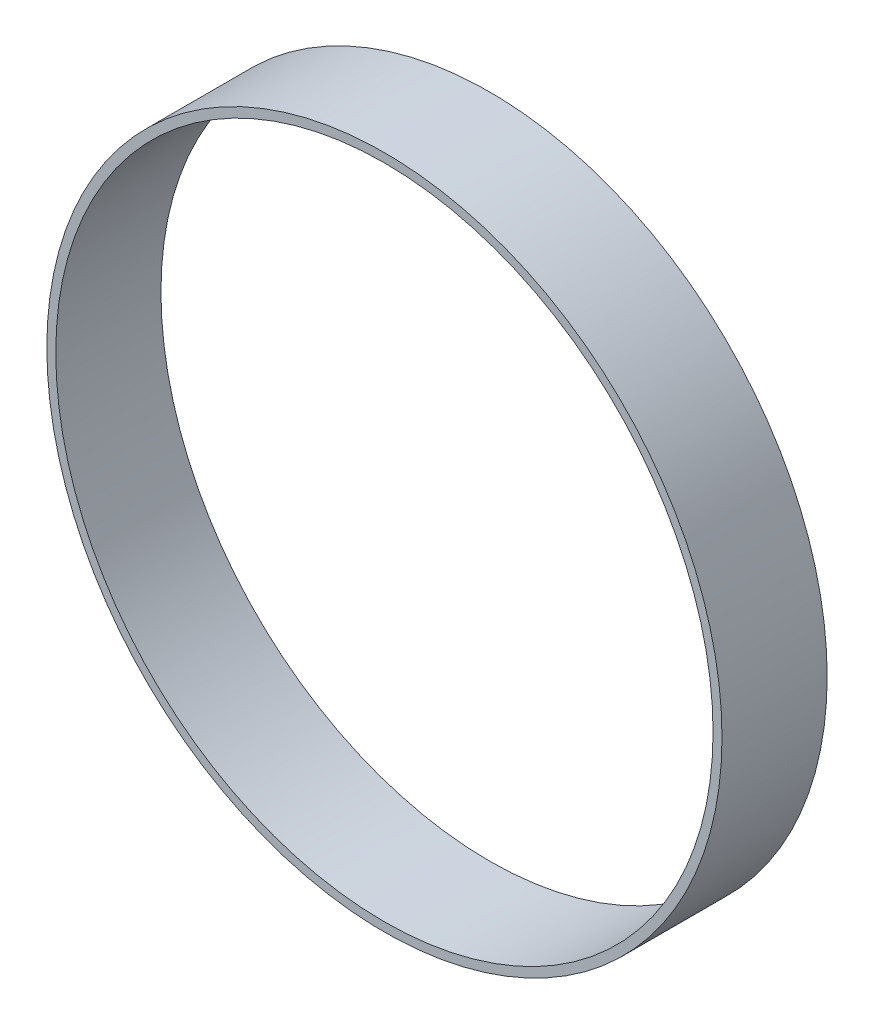
ISO-10303-21;
HEADER;
FILE_DESCRIPTION(('STEP AP214'),'2;1');
FILE_NAME('part.step','',(''),(''),'','','');
FILE_SCHEMA(('AUTOMOTIVE_DESIGN { 1 0 10303 214 1 1 1 1 }'));
ENDSEC;
DATA;
#1=APPLICATION_CONTEXT('core data for automotive mechanical design processes');
#2=APPLICATION_PROTOCOL_DEFINITION('international standard','automotive_design',2000,#1);
#3=PRODUCT_CONTEXT('',#1,'mechanical');
#4=PRODUCT('Part','Part','',(#3));
#5=PRODUCT_RELATED_PRODUCT_CATEGORY('part','',(#4));
#6=PRODUCT_DEFINITION_FORMATION('','',#4);
#7=PRODUCT_DEFINITION_CONTEXT('part definition',#1,'design');
#8=PRODUCT_DEFINITION('design','',#6,#7);
#9=PRODUCT_DEFINITION_SHAPE('','',#8);
#10=(LENGTH_UNIT() NAMED_UNIT(*) SI_UNIT(.MILLI.,.METRE.));
#11=(NAMED_UNIT(*) PLANE_ANGLE_UNIT() SI_UNIT($,.RADIAN.));
#12=(NAMED_UNIT(*) SI_UNIT($,.STERADIAN.) SOLID_ANGLE_UNIT());
#13=UNCERTAINTY_MEASURE_WITH_UNIT(LENGTH_MEASURE(1.E-05),#10,'distance_accuracy_value','');
#14=(GEOMETRIC_REPRESENTATION_CONTEXT(3) GLOBAL_UNCERTAINTY_ASSIGNED_CONTEXT((#13)) GLOBAL_UNIT_ASSIGNED_CONTEXT((#10,
#11,#12)) REPRESENTATION_CONTEXT('',''));
#15=CARTESIAN_POINT('',(0.,0.,0.));
#16=DIRECTION('',(0.,0.,1.));
#17=DIRECTION('',(1.,0.,0.));
#18=AXIS2_PLACEMENT_3D('',#15,#16,#17);
#19=CARTESIAN_POINT('',(0.,0.,20.));
#20=DIRECTION('',(0.,0.,1.));
#21=DIRECTION('',(1.,0.,0.));
#22=AXIS2_PLACEMENT_3D('',#19,#20,#21);
#23=PLANE('',#22);
#24=CARTESIAN_POINT('',(0.,0.,20.));
#25=DIRECTION('',(0.,0.,1.));
#26=DIRECTION('',(1.,0.,0.));
#27=AXIS2_PLACEMENT_3D('',#24,#25,#26);
#28=CIRCLE('',#27,64.2);
#29=CARTESIAN_POINT('',(64.2,0.,20.));
#30=VERTEX_POINT('',#29);
#31=EDGE_CURVE('E10',#30,#30,#28,.T.);
#32=ORIENTED_EDGE('',*,*,#31,.T.);
#33=EDGE_LOOP('',(#32));
#34=FACE_BOUND('',#33,.T.);
#35=CARTESIAN_POINT('',(0.,0.,20.));
#36=DIRECTION('',(0.,0.,1.));
#37=DIRECTION('',(1.,0.,0.));
#38=AXIS2_PLACEMENT_3D('',#35,#36,#37);
#39=CIRCLE('',#38,62.5);
#40=CARTESIAN_POINT('',(62.5,0.,20.));
#41=VERTEX_POINT('',#40);
#42=EDGE_CURVE('E42',#41,#41,#39,.T.);
#43=ORIENTED_EDGE('',*,*,#42,.F.);
#44=EDGE_LOOP('',(#43));
#45=FACE_BOUND('',#44,.T.);
#46=ADVANCED_FACE('F31',(#34,#45),#23,.T.);
#47=CARTESIAN_POINT('',(0.,0.,0.));
#48=DIRECTION('',(0.,0.,1.));
#49=DIRECTION('',(1.,0.,0.));
#50=AXIS2_PLACEMENT_3D('',#47,#48,#49);
#51=PLANE('',#50);
#52=CARTESIAN_POINT('',(0.,0.,0.));
#53=DIRECTION('',(0.,0.,1.));
#54=DIRECTION('',(1.,0.,0.));
#55=AXIS2_PLACEMENT_3D('',#52,#53,#54);
#56=CIRCLE('',#55,64.2);
#57=CARTESIAN_POINT('',(64.2,0.,0.));
#58=VERTEX_POINT('',#57);
#59=EDGE_CURVE('E35',#58,#58,#56,.T.);
#60=ORIENTED_EDGE('',*,*,#59,.F.);
#61=EDGE_LOOP('',(#60));
#62=FACE_BOUND('',#61,.T.);
#63=CARTESIAN_POINT('',(0.,0.,0.));
#64=DIRECTION('',(0.,0.,1.));
#65=DIRECTION('',(1.,0.,0.));
#66=AXIS2_PLACEMENT_3D('',#63,#64,#65);
#67=CIRCLE('',#66,62.5);
#68=CARTESIAN_POINT('',(62.5,0.,0.));
#69=VERTEX_POINT('',#68);
#70=EDGE_CURVE('E44',#69,#69,#67,.T.);
#71=ORIENTED_EDGE('',*,*,#70,.T.);
#72=EDGE_LOOP('',(#71));
#73=FACE_BOUND('',#72,.T.);
#74=ADVANCED_FACE('F54',(#62,#73),#51,.F.);
#75=CARTESIAN_POINT('',(0.,0.,20.));
#76=DIRECTION('',(0.,0.,-1.));
#77=DIRECTION('',(-1.,0.,0.));
#78=AXIS2_PLACEMENT_3D('',#75,#76,#77);
#79=CYLINDRICAL_SURFACE('',#78,64.2);
#80=ORIENTED_EDGE('',*,*,#31,.F.);
#81=EDGE_LOOP('',(#80));
#82=FACE_BOUND('',#81,.T.);
#83=ORIENTED_EDGE('',*,*,#59,.T.);
#84=EDGE_LOOP('',(#83));
#85=FACE_BOUND('',#84,.T.);
#86=ADVANCED_FACE('F33',(#82,#85),#79,.T.);
#87=CARTESIAN_POINT('',(0.,0.,20.));
#88=DIRECTION('',(0.,0.,-1.));
#89=DIRECTION('',(-1.,0.,0.));
#90=AXIS2_PLACEMENT_3D('',#87,#88,#89);
#91=CYLINDRICAL_SURFACE('',#90,62.5);
#92=ORIENTED_EDGE('',*,*,#42,.T.);
#93=EDGE_LOOP('',(#92));
#94=FACE_BOUND('',#93,.T.);
#95=ORIENTED_EDGE('',*,*,#70,.F.);
#96=EDGE_LOOP('',(#95));
#97=FACE_BOUND('',#96,.T.);
#98=ADVANCED_FACE('F50',(#94,#97),#91,.F.);
#99=CLOSED_SHELL('',(#46,#74,#86,#98));
#100=MANIFOLD_SOLID_BREP('B2',#99);
#101=ADVANCED_BREP_SHAPE_REPRESENTATION('',(#18,#100),#14);
#102=SHAPE_DEFINITION_REPRESENTATION(#9,#101);
ENDSEC;
END-ISO-10303-21;
